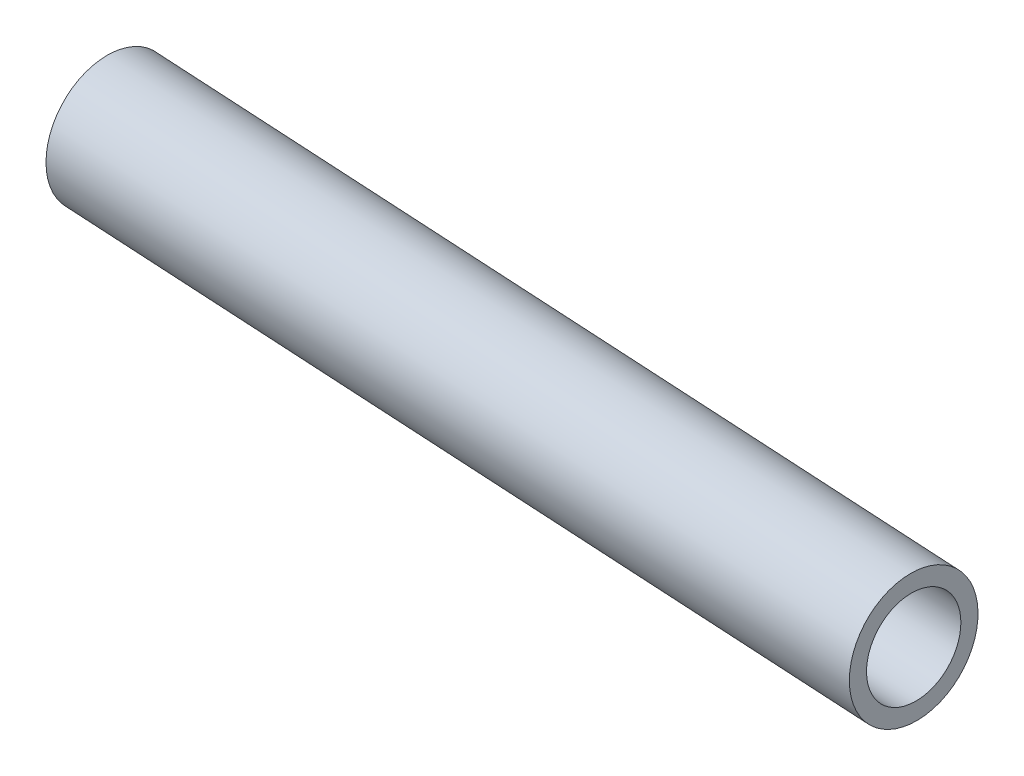
ISO-10303-21;
HEADER;
FILE_DESCRIPTION(('STEP AP214'),'2;1');
FILE_NAME('part.step','',(''),(''),'','','');
FILE_SCHEMA(('AUTOMOTIVE_DESIGN { 1 0 10303 214 1 1 1 1 }'));
ENDSEC;
DATA;
#1=APPLICATION_CONTEXT('core data for automotive mechanical design processes');
#2=APPLICATION_PROTOCOL_DEFINITION('international standard','automotive_design',2000,#1);
#3=PRODUCT_CONTEXT('',#1,'mechanical');
#4=PRODUCT('Part','Part','',(#3));
#5=PRODUCT_RELATED_PRODUCT_CATEGORY('part','',(#4));
#6=PRODUCT_DEFINITION_FORMATION('','',#4);
#7=PRODUCT_DEFINITION_CONTEXT('part definition',#1,'design');
#8=PRODUCT_DEFINITION('design','',#6,#7);
#9=PRODUCT_DEFINITION_SHAPE('','',#8);
#10=(LENGTH_UNIT() NAMED_UNIT(*) SI_UNIT(.MILLI.,.METRE.));
#11=(NAMED_UNIT(*) PLANE_ANGLE_UNIT() SI_UNIT($,.RADIAN.));
#12=(NAMED_UNIT(*) SI_UNIT($,.STERADIAN.) SOLID_ANGLE_UNIT());
#13=UNCERTAINTY_MEASURE_WITH_UNIT(LENGTH_MEASURE(1.E-05),#10,'distance_accuracy_value','');
#14=(GEOMETRIC_REPRESENTATION_CONTEXT(3) GLOBAL_UNCERTAINTY_ASSIGNED_CONTEXT((#13)) GLOBAL_UNIT_ASSIGNED_CONTEXT((#10,
#11,#12)) REPRESENTATION_CONTEXT('',''));
#15=CARTESIAN_POINT('',(0.,0.,0.));
#16=DIRECTION('',(0.,0.,1.));
#17=DIRECTION('',(1.,0.,0.));
#18=AXIS2_PLACEMENT_3D('',#15,#16,#17);
#19=CARTESIAN_POINT('',(20.7,18.084291804665,13.260430420002));
#20=DIRECTION('',(0.951034068730757,-0.249257646596287,-0.18276987094897));
#21=DIRECTION('',(0.253528145079078,0.967328010373297,0.));
#22=AXIS2_PLACEMENT_3D('',#19,#20,#21);
#23=CYLINDRICAL_SURFACE('',#22,1.65);
#24=DIRECTION('',(0.951034068730843,-0.249257646595959,-0.18276987094897));
#25=VECTOR('',#24,1.);
#26=CARTESIAN_POINT('',(21.11832143938,19.680383021782,13.260430420002));
#27=LINE('',#26,#25);
#28=CARTESIAN_POINT('',(25.7,18.479565455906,12.379922742322));
#29=VERTEX_POINT('',#28);
#30=CARTESIAN_POINT('',(49.7,12.189377002109,7.767599117973));
#31=VERTEX_POINT('',#30);
#32=EDGE_CURVE('E11',#29,#31,#27,.T.);
#33=ORIENTED_EDGE('',*,*,#32,.F.);
#34=CARTESIAN_POINT('',(25.7,16.773835876791,12.299529664929));
#35=DIRECTION('',(1.,0.,0.));
#36=DIRECTION('',(0.,-0.806434417153338,-0.591323541583248));
#37=AXIS2_PLACEMENT_3D('',#34,#35,#36);
#38=ELLIPSE('',#37,1.734953619697,1.65);
#39=EDGE_CURVE('E27',#29,#29,#38,.T.);
#40=ORIENTED_EDGE('',*,*,#39,.F.);
#41=ORIENTED_EDGE('',*,*,#32,.T.);
#42=CARTESIAN_POINT('',(49.7,10.483647422994,7.687206040581));
#43=DIRECTION('',(1.,0.,0.));
#44=DIRECTION('',(0.,-0.806434417153338,-0.591323541583248));
#45=AXIS2_PLACEMENT_3D('',#42,#43,#44);
#46=ELLIPSE('',#45,1.734953619697,1.65);
#47=EDGE_CURVE('E58',#31,#31,#46,.T.);
#48=ORIENTED_EDGE('',*,*,#47,.T.);
#49=EDGE_LOOP('',(#33,#40,#41,#48));
#50=FACE_BOUND('',#49,.T.);
#51=ADVANCED_FACE('F17',(#50),#23,.F.);
#52=CARTESIAN_POINT('',(25.7,-50.,-50.));
#53=DIRECTION('',(1.,0.,0.));
#54=DIRECTION('',(0.,1.,0.));
#55=AXIS2_PLACEMENT_3D('',#52,#53,#54);
#56=PLANE('',#55);
#57=ORIENTED_EDGE('',*,*,#39,.T.);
#58=EDGE_LOOP('',(#57));
#59=FACE_BOUND('',#58,.T.);
#60=CARTESIAN_POINT('',(25.7,16.773835876791,12.299529664929));
#61=DIRECTION('',(1.,0.,0.));
#62=DIRECTION('',(0.,-0.806434417153338,-0.591323541583248));
#63=AXIS2_PLACEMENT_3D('',#60,#61,#62);
#64=ELLIPSE('',#63,2.365845845041,2.25);
#65=CARTESIAN_POINT('',(25.7,19.099830757402,12.409156588646));
#66=VERTEX_POINT('',#65);
#67=EDGE_CURVE('E54',#66,#66,#64,.T.);
#68=ORIENTED_EDGE('',*,*,#67,.F.);
#69=EDGE_LOOP('',(#68));
#70=FACE_BOUND('',#69,.T.);
#71=ADVANCED_FACE('F73',(#59,#70),#56,.F.);
#72=CARTESIAN_POINT('',(49.7,-50.,-50.));
#73=DIRECTION('',(1.,0.,0.));
#74=DIRECTION('',(0.,1.,0.));
#75=AXIS2_PLACEMENT_3D('',#72,#73,#74);
#76=PLANE('',#75);
#77=ORIENTED_EDGE('',*,*,#47,.F.);
#78=EDGE_LOOP('',(#77));
#79=FACE_BOUND('',#78,.T.);
#80=CARTESIAN_POINT('',(49.7,10.483647422994,7.687206040581));
#81=DIRECTION('',(1.,0.,0.));
#82=DIRECTION('',(0.,-0.806434417153338,-0.591323541583248));
#83=AXIS2_PLACEMENT_3D('',#80,#81,#82);
#84=ELLIPSE('',#83,2.365845845041,2.25);
#85=CARTESIAN_POINT('',(49.7,12.809642303605,7.796832964298));
#86=VERTEX_POINT('',#85);
#87=EDGE_CURVE('E65',#86,#86,#84,.T.);
#88=ORIENTED_EDGE('',*,*,#87,.T.);
#89=EDGE_LOOP('',(#88));
#90=FACE_BOUND('',#89,.T.);
#91=ADVANCED_FACE('F71',(#79,#90),#76,.T.);
#92=CARTESIAN_POINT('',(20.7,18.084291804665,13.260430420002));
#93=DIRECTION('',(0.951034068730757,-0.249257646596287,-0.18276987094897));
#94=DIRECTION('',(0.253528145079078,0.967328010373297,0.));
#95=AXIS2_PLACEMENT_3D('',#92,#93,#94);
#96=CYLINDRICAL_SURFACE('',#95,2.25);
#97=ORIENTED_EDGE('',*,*,#87,.F.);
#98=DIRECTION('',(0.951034068730843,-0.249257646595959,-0.18276987094897));
#99=VECTOR('',#98,1.);
#100=CARTESIAN_POINT('',(21.270438326427,20.260779828006,13.260430420002));
#101=LINE('',#100,#99);
#102=EDGE_CURVE('E20',#66,#86,#101,.T.);
#103=ORIENTED_EDGE('',*,*,#102,.F.);
#104=ORIENTED_EDGE('',*,*,#67,.T.);
#105=ORIENTED_EDGE('',*,*,#102,.T.);
#106=EDGE_LOOP('',(#97,#103,#104,#105));
#107=FACE_BOUND('',#106,.T.);
#108=ADVANCED_FACE('F55',(#107),#96,.T.);
#109=CLOSED_SHELL('',(#51,#71,#91,#108));
#110=MANIFOLD_SOLID_BREP('B1',#109);
#111=ADVANCED_BREP_SHAPE_REPRESENTATION('',(#18,#110),#14);
#112=SHAPE_DEFINITION_REPRESENTATION(#9,#111);
ENDSEC;
END-ISO-10303-21;
